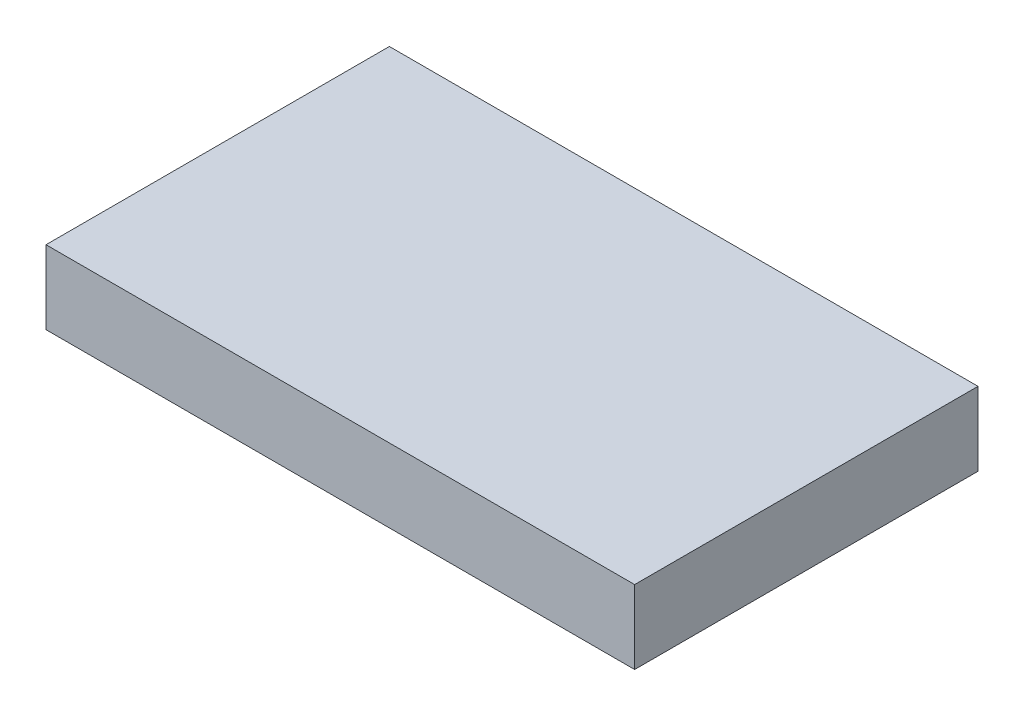
ISO-10303-21;
HEADER;
FILE_DESCRIPTION(('STEP AP214'),'2;1');
FILE_NAME('part.step','',(''),(''),'','','');
FILE_SCHEMA(('AUTOMOTIVE_DESIGN { 1 0 10303 214 1 1 1 1 }'));
ENDSEC;
DATA;
#1=APPLICATION_CONTEXT('core data for automotive mechanical design processes');
#2=APPLICATION_PROTOCOL_DEFINITION('international standard','automotive_design',2000,#1);
#3=PRODUCT_CONTEXT('',#1,'mechanical');
#4=PRODUCT('Part','Part','',(#3));
#5=PRODUCT_RELATED_PRODUCT_CATEGORY('part','',(#4));
#6=PRODUCT_DEFINITION_FORMATION('','',#4);
#7=PRODUCT_DEFINITION_CONTEXT('part definition',#1,'design');
#8=PRODUCT_DEFINITION('design','',#6,#7);
#9=PRODUCT_DEFINITION_SHAPE('','',#8);
#10=(LENGTH_UNIT() NAMED_UNIT(*) SI_UNIT(.MILLI.,.METRE.));
#11=(NAMED_UNIT(*) PLANE_ANGLE_UNIT() SI_UNIT($,.RADIAN.));
#12=(NAMED_UNIT(*) SI_UNIT($,.STERADIAN.) SOLID_ANGLE_UNIT());
#13=UNCERTAINTY_MEASURE_WITH_UNIT(LENGTH_MEASURE(1.E-05),#10,'distance_accuracy_value','');
#14=(GEOMETRIC_REPRESENTATION_CONTEXT(3) GLOBAL_UNCERTAINTY_ASSIGNED_CONTEXT((#13)) GLOBAL_UNIT_ASSIGNED_CONTEXT((#10,
#11,#12)) REPRESENTATION_CONTEXT('',''));
#15=CARTESIAN_POINT('',(0.,0.,0.));
#16=DIRECTION('',(0.,0.,1.));
#17=DIRECTION('',(1.,0.,0.));
#18=AXIS2_PLACEMENT_3D('',#15,#16,#17);
#19=CARTESIAN_POINT('',(0.,9.525,0.));
#20=DIRECTION('',(1.,0.,0.));
#21=DIRECTION('',(0.,0.,-1.));
#22=AXIS2_PLACEMENT_3D('',#19,#20,#21);
#23=PLANE('',#22);
#24=DIRECTION('',(0.,0.,1.));
#25=VECTOR('',#24,1.);
#26=CARTESIAN_POINT('',(0.,0.,0.));
#27=LINE('',#26,#25);
#28=CARTESIAN_POINT('',(0.,0.,-44.45));
#29=VERTEX_POINT('',#28);
#30=CARTESIAN_POINT('',(0.,0.,0.));
#31=VERTEX_POINT('',#30);
#32=EDGE_CURVE('E97',#29,#31,#27,.T.);
#33=ORIENTED_EDGE('',*,*,#32,.T.);
#34=DIRECTION('',(0.,-1.,0.));
#35=VECTOR('',#34,1.);
#36=CARTESIAN_POINT('',(0.,9.525,0.));
#37=LINE('',#36,#35);
#38=CARTESIAN_POINT('',(0.,9.525,0.));
#39=VERTEX_POINT('',#38);
#40=EDGE_CURVE('E11',#39,#31,#37,.T.);
#41=ORIENTED_EDGE('',*,*,#40,.F.);
#42=DIRECTION('',(0.,0.,1.));
#43=VECTOR('',#42,1.);
#44=CARTESIAN_POINT('',(0.,9.525,0.));
#45=LINE('',#44,#43);
#46=CARTESIAN_POINT('',(0.,9.525,-44.45));
#47=VERTEX_POINT('',#46);
#48=EDGE_CURVE('E85',#47,#39,#45,.T.);
#49=ORIENTED_EDGE('',*,*,#48,.F.);
#50=DIRECTION('',(0.,-1.,0.));
#51=VECTOR('',#50,1.);
#52=CARTESIAN_POINT('',(0.,9.525,-44.45));
#53=LINE('',#52,#51);
#54=EDGE_CURVE('E93',#47,#29,#53,.T.);
#55=ORIENTED_EDGE('',*,*,#54,.T.);
#56=EDGE_LOOP('',(#33,#41,#49,#55));
#57=FACE_BOUND('',#56,.T.);
#58=ADVANCED_FACE('F34',(#57),#23,.F.);
#59=CARTESIAN_POINT('',(0.,9.525,0.));
#60=DIRECTION('',(0.,0.,-1.));
#61=DIRECTION('',(-1.,0.,0.));
#62=AXIS2_PLACEMENT_3D('',#59,#60,#61);
#63=PLANE('',#62);
#64=DIRECTION('',(1.,0.,0.));
#65=VECTOR('',#64,1.);
#66=CARTESIAN_POINT('',(0.,0.,0.));
#67=LINE('',#66,#65);
#68=CARTESIAN_POINT('',(76.2,0.,0.));
#69=VERTEX_POINT('',#68);
#70=EDGE_CURVE('E89',#31,#69,#67,.T.);
#71=ORIENTED_EDGE('',*,*,#70,.T.);
#72=DIRECTION('',(0.,-1.,0.));
#73=VECTOR('',#72,1.);
#74=CARTESIAN_POINT('',(76.2,9.525,0.));
#75=LINE('',#74,#73);
#76=CARTESIAN_POINT('',(76.2,9.525,0.));
#77=VERTEX_POINT('',#76);
#78=EDGE_CURVE('E42',#77,#69,#75,.T.);
#79=ORIENTED_EDGE('',*,*,#78,.F.);
#80=DIRECTION('',(1.,0.,0.));
#81=VECTOR('',#80,1.);
#82=CARTESIAN_POINT('',(0.,9.525,0.));
#83=LINE('',#82,#81);
#84=EDGE_CURVE('E80',#39,#77,#83,.T.);
#85=ORIENTED_EDGE('',*,*,#84,.F.);
#86=ORIENTED_EDGE('',*,*,#40,.T.);
#87=EDGE_LOOP('',(#71,#79,#85,#86));
#88=FACE_BOUND('',#87,.T.);
#89=ADVANCED_FACE('F88',(#88),#63,.F.);
#90=CARTESIAN_POINT('',(76.2,9.525,0.));
#91=DIRECTION('',(-1.,0.,0.));
#92=DIRECTION('',(0.,0.,1.));
#93=AXIS2_PLACEMENT_3D('',#90,#91,#92);
#94=PLANE('',#93);
#95=DIRECTION('',(0.,0.,-1.));
#96=VECTOR('',#95,1.);
#97=CARTESIAN_POINT('',(76.2,0.,0.));
#98=LINE('',#97,#96);
#99=CARTESIAN_POINT('',(76.2,0.,-44.45));
#100=VERTEX_POINT('',#99);
#101=EDGE_CURVE('E67',#69,#100,#98,.T.);
#102=ORIENTED_EDGE('',*,*,#101,.T.);
#103=DIRECTION('',(0.,-1.,0.));
#104=VECTOR('',#103,1.);
#105=CARTESIAN_POINT('',(76.2,9.525,-44.45));
#106=LINE('',#105,#104);
#107=CARTESIAN_POINT('',(76.2,9.525,-44.45));
#108=VERTEX_POINT('',#107);
#109=EDGE_CURVE('E90',#108,#100,#106,.T.);
#110=ORIENTED_EDGE('',*,*,#109,.F.);
#111=DIRECTION('',(0.,0.,-1.));
#112=VECTOR('',#111,1.);
#113=CARTESIAN_POINT('',(76.2,9.525,0.));
#114=LINE('',#113,#112);
#115=EDGE_CURVE('E83',#77,#108,#114,.T.);
#116=ORIENTED_EDGE('',*,*,#115,.F.);
#117=ORIENTED_EDGE('',*,*,#78,.T.);
#118=EDGE_LOOP('',(#102,#110,#116,#117));
#119=FACE_BOUND('',#118,.T.);
#120=ADVANCED_FACE('F91',(#119),#94,.F.);
#121=CARTESIAN_POINT('',(0.,9.525,-44.45));
#122=DIRECTION('',(0.,0.,1.));
#123=DIRECTION('',(1.,0.,0.));
#124=AXIS2_PLACEMENT_3D('',#121,#122,#123);
#125=PLANE('',#124);
#126=DIRECTION('',(-1.,0.,0.));
#127=VECTOR('',#126,1.);
#128=CARTESIAN_POINT('',(0.,0.,-44.45));
#129=LINE('',#128,#127);
#130=EDGE_CURVE('E73',#100,#29,#129,.T.);
#131=ORIENTED_EDGE('',*,*,#130,.T.);
#132=ORIENTED_EDGE('',*,*,#54,.F.);
#133=DIRECTION('',(-1.,0.,0.));
#134=VECTOR('',#133,1.);
#135=CARTESIAN_POINT('',(0.,9.525,-44.45));
#136=LINE('',#135,#134);
#137=EDGE_CURVE('E50',#108,#47,#136,.T.);
#138=ORIENTED_EDGE('',*,*,#137,.F.);
#139=ORIENTED_EDGE('',*,*,#109,.T.);
#140=EDGE_LOOP('',(#131,#132,#138,#139));
#141=FACE_BOUND('',#140,.T.);
#142=ADVANCED_FACE('F104',(#141),#125,.F.);
#143=CARTESIAN_POINT('',(0.,9.525,0.));
#144=DIRECTION('',(0.,-1.,0.));
#145=DIRECTION('',(0.,0.,-1.));
#146=AXIS2_PLACEMENT_3D('',#143,#144,#145);
#147=PLANE('',#146);
#148=ORIENTED_EDGE('',*,*,#48,.T.);
#149=ORIENTED_EDGE('',*,*,#84,.T.);
#150=ORIENTED_EDGE('',*,*,#115,.T.);
#151=ORIENTED_EDGE('',*,*,#137,.T.);
#152=EDGE_LOOP('',(#148,#149,#150,#151));
#153=FACE_BOUND('',#152,.T.);
#154=ADVANCED_FACE('F81',(#153),#147,.F.);
#155=CARTESIAN_POINT('',(0.,0.,0.));
#156=DIRECTION('',(0.,-1.,0.));
#157=DIRECTION('',(0.,0.,-1.));
#158=AXIS2_PLACEMENT_3D('',#155,#156,#157);
#159=PLANE('',#158);
#160=ORIENTED_EDGE('',*,*,#32,.F.);
#161=ORIENTED_EDGE('',*,*,#130,.F.);
#162=ORIENTED_EDGE('',*,*,#101,.F.);
#163=ORIENTED_EDGE('',*,*,#70,.F.);
#164=EDGE_LOOP('',(#160,#161,#162,#163));
#165=FACE_BOUND('',#164,.T.);
#166=ADVANCED_FACE('F107',(#165),#159,.T.);
#167=CLOSED_SHELL('',(#58,#89,#120,#142,#154,#166));
#168=MANIFOLD_SOLID_BREP('B2',#167);
#169=ADVANCED_BREP_SHAPE_REPRESENTATION('',(#18,#168),#14);
#170=SHAPE_DEFINITION_REPRESENTATION(#9,#169);
ENDSEC;
END-ISO-10303-21;
